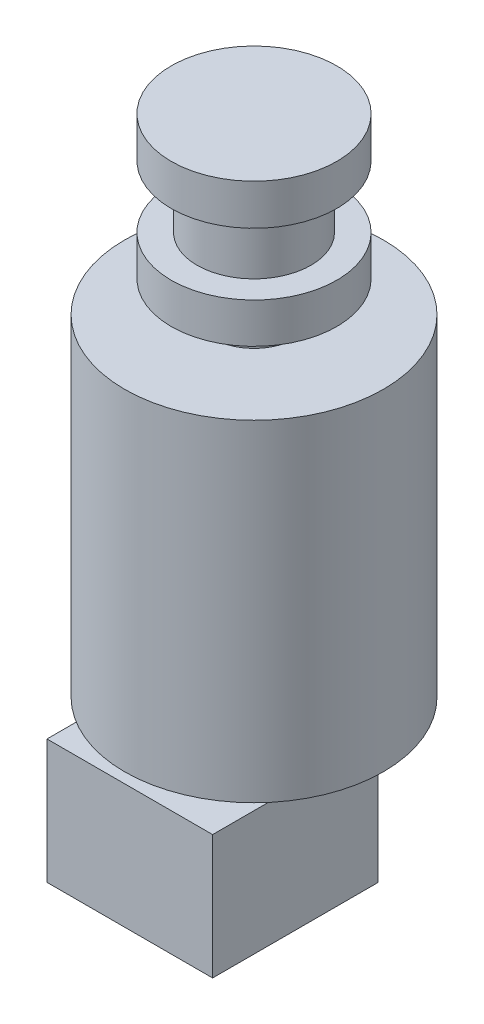
ISO-10303-21;
HEADER;
FILE_DESCRIPTION(('STEP AP214'),'2;1');
FILE_NAME('part.step','',(''),(''),'','','');
FILE_SCHEMA(('AUTOMOTIVE_DESIGN { 1 0 10303 214 1 1 1 1 }'));
ENDSEC;
DATA;
#1=APPLICATION_CONTEXT('core data for automotive mechanical design processes');
#2=APPLICATION_PROTOCOL_DEFINITION('international standard','automotive_design',2000,#1);
#3=PRODUCT_CONTEXT('',#1,'mechanical');
#4=PRODUCT('Part','Part','',(#3));
#5=PRODUCT_RELATED_PRODUCT_CATEGORY('part','',(#4));
#6=PRODUCT_DEFINITION_FORMATION('','',#4);
#7=PRODUCT_DEFINITION_CONTEXT('part definition',#1,'design');
#8=PRODUCT_DEFINITION('design','',#6,#7);
#9=PRODUCT_DEFINITION_SHAPE('','',#8);
#10=(LENGTH_UNIT() NAMED_UNIT(*) SI_UNIT(.MILLI.,.METRE.));
#11=(NAMED_UNIT(*) PLANE_ANGLE_UNIT() SI_UNIT($,.RADIAN.));
#12=(NAMED_UNIT(*) SI_UNIT($,.STERADIAN.) SOLID_ANGLE_UNIT());
#13=UNCERTAINTY_MEASURE_WITH_UNIT(LENGTH_MEASURE(1.E-05),#10,'distance_accuracy_value','');
#14=(GEOMETRIC_REPRESENTATION_CONTEXT(3) GLOBAL_UNCERTAINTY_ASSIGNED_CONTEXT((#13)) GLOBAL_UNIT_ASSIGNED_CONTEXT((#10,
#11,#12)) REPRESENTATION_CONTEXT('',''));
#15=CARTESIAN_POINT('',(0.,0.,0.));
#16=DIRECTION('',(0.,0.,1.));
#17=DIRECTION('',(1.,0.,0.));
#18=AXIS2_PLACEMENT_3D('',#15,#16,#17);
#19=CARTESIAN_POINT('',(0.,47.3333622183709,0.));
#20=DIRECTION('',(0.,-1.,0.));
#21=DIRECTION('',(0.,0.,-1.));
#22=AXIS2_PLACEMENT_3D('',#19,#20,#21);
#23=PLANE('',#22);
#24=CARTESIAN_POINT('',(0.,47.3333622183709,0.));
#25=DIRECTION('',(0.,1.,0.));
#26=DIRECTION('',(0.,0.,1.));
#27=AXIS2_PLACEMENT_3D('',#24,#25,#26);
#28=CIRCLE('',#27,8.);
#29=CARTESIAN_POINT('',(0.,47.3333622183709,8.));
#30=VERTEX_POINT('',#29);
#31=EDGE_CURVE('E11',#30,#30,#28,.T.);
#32=ORIENTED_EDGE('',*,*,#31,.T.);
#33=EDGE_LOOP('',(#32));
#34=FACE_BOUND('',#33,.T.);
#35=ADVANCED_FACE('F33',(#34),#23,.F.);
#36=CARTESIAN_POINT('',(0.,47.3333622183709,0.));
#37=DIRECTION('',(0.,1.,0.));
#38=DIRECTION('',(0.,0.,1.));
#39=AXIS2_PLACEMENT_3D('',#36,#37,#38);
#40=CYLINDRICAL_SURFACE('',#39,8.);
#41=ORIENTED_EDGE('',*,*,#31,.F.);
#42=EDGE_LOOP('',(#41));
#43=FACE_BOUND('',#42,.T.);
#44=CARTESIAN_POINT('',(0.,43.3916496951795,0.));
#45=DIRECTION('',(0.,1.,0.));
#46=DIRECTION('',(0.,0.,1.));
#47=AXIS2_PLACEMENT_3D('',#44,#45,#46);
#48=CIRCLE('',#47,8.);
#49=CARTESIAN_POINT('',(0.,43.3916496951795,8.));
#50=VERTEX_POINT('',#49);
#51=EDGE_CURVE('E41',#50,#50,#48,.T.);
#52=ORIENTED_EDGE('',*,*,#51,.T.);
#53=EDGE_LOOP('',(#52));
#54=FACE_BOUND('',#53,.T.);
#55=ADVANCED_FACE('F142',(#43,#54),#40,.T.);
#56=CARTESIAN_POINT('',(5.5,43.3916496951795,0.));
#57=DIRECTION('',(0.,1.,0.));
#58=DIRECTION('',(0.,0.,1.));
#59=AXIS2_PLACEMENT_3D('',#56,#57,#58);
#60=PLANE('',#59);
#61=ORIENTED_EDGE('',*,*,#51,.F.);
#62=EDGE_LOOP('',(#61));
#63=FACE_BOUND('',#62,.T.);
#64=CARTESIAN_POINT('',(0.,43.3916496951795,0.));
#65=DIRECTION('',(0.,1.,0.));
#66=DIRECTION('',(0.,0.,1.));
#67=AXIS2_PLACEMENT_3D('',#64,#65,#66);
#68=CIRCLE('',#67,5.5);
#69=CARTESIAN_POINT('',(0.,43.3916496951795,5.5));
#70=VERTEX_POINT('',#69);
#71=EDGE_CURVE('E137',#70,#70,#68,.T.);
#72=ORIENTED_EDGE('',*,*,#71,.T.);
#73=EDGE_LOOP('',(#72));
#74=FACE_BOUND('',#73,.T.);
#75=ADVANCED_FACE('F144',(#63,#74),#60,.F.);
#76=CARTESIAN_POINT('',(0.,47.3333622183709,0.));
#77=DIRECTION('',(0.,1.,0.));
#78=DIRECTION('',(0.,0.,1.));
#79=AXIS2_PLACEMENT_3D('',#76,#77,#78);
#80=CYLINDRICAL_SURFACE('',#79,5.5);
#81=ORIENTED_EDGE('',*,*,#71,.F.);
#82=EDGE_LOOP('',(#81));
#83=FACE_BOUND('',#82,.T.);
#84=CARTESIAN_POINT('',(0.,37.3916496951795,0.));
#85=DIRECTION('',(0.,1.,0.));
#86=DIRECTION('',(0.,0.,1.));
#87=AXIS2_PLACEMENT_3D('',#84,#85,#86);
#88=CIRCLE('',#87,5.5);
#89=CARTESIAN_POINT('',(0.,37.3916496951795,5.5));
#90=VERTEX_POINT('',#89);
#91=EDGE_CURVE('E134',#90,#90,#88,.T.);
#92=ORIENTED_EDGE('',*,*,#91,.T.);
#93=EDGE_LOOP('',(#92));
#94=FACE_BOUND('',#93,.T.);
#95=ADVANCED_FACE('F147',(#83,#94),#80,.T.);
#96=CARTESIAN_POINT('',(5.5,37.3916496951795,0.));
#97=DIRECTION('',(0.,-1.,0.));
#98=DIRECTION('',(0.,0.,-1.));
#99=AXIS2_PLACEMENT_3D('',#96,#97,#98);
#100=PLANE('',#99);
#101=ORIENTED_EDGE('',*,*,#91,.F.);
#102=EDGE_LOOP('',(#101));
#103=FACE_BOUND('',#102,.T.);
#104=CARTESIAN_POINT('',(0.,37.3916496951795,0.));
#105=DIRECTION('',(0.,1.,0.));
#106=DIRECTION('',(0.,0.,1.));
#107=AXIS2_PLACEMENT_3D('',#104,#105,#106);
#108=CIRCLE('',#107,8.);
#109=CARTESIAN_POINT('',(0.,37.3916496951795,8.));
#110=VERTEX_POINT('',#109);
#111=EDGE_CURVE('E131',#110,#110,#108,.T.);
#112=ORIENTED_EDGE('',*,*,#111,.T.);
#113=EDGE_LOOP('',(#112));
#114=FACE_BOUND('',#113,.T.);
#115=ADVANCED_FACE('F153',(#103,#114),#100,.F.);
#116=CARTESIAN_POINT('',(0.,47.3333622183709,0.));
#117=DIRECTION('',(0.,1.,0.));
#118=DIRECTION('',(0.,0.,1.));
#119=AXIS2_PLACEMENT_3D('',#116,#117,#118);
#120=CYLINDRICAL_SURFACE('',#119,8.);
#121=ORIENTED_EDGE('',*,*,#111,.F.);
#122=EDGE_LOOP('',(#121));
#123=FACE_BOUND('',#122,.T.);
#124=CARTESIAN_POINT('',(0.,33.514974638981,0.));
#125=DIRECTION('',(0.,1.,0.));
#126=DIRECTION('',(0.,0.,1.));
#127=AXIS2_PLACEMENT_3D('',#124,#125,#126);
#128=CIRCLE('',#127,8.);
#129=CARTESIAN_POINT('',(0.,33.514974638981,8.));
#130=VERTEX_POINT('',#129);
#131=EDGE_CURVE('E128',#130,#130,#128,.T.);
#132=ORIENTED_EDGE('',*,*,#131,.T.);
#133=EDGE_LOOP('',(#132));
#134=FACE_BOUND('',#133,.T.);
#135=ADVANCED_FACE('F159',(#123,#134),#120,.T.);
#136=CARTESIAN_POINT('',(8.,33.514974638981,0.));
#137=DIRECTION('',(0.,1.,0.));
#138=DIRECTION('',(0.,0.,1.));
#139=AXIS2_PLACEMENT_3D('',#136,#137,#138);
#140=PLANE('',#139);
#141=ORIENTED_EDGE('',*,*,#131,.F.);
#142=EDGE_LOOP('',(#141));
#143=FACE_BOUND('',#142,.T.);
#144=CARTESIAN_POINT('',(0.,33.5149746389809,0.));
#145=DIRECTION('',(0.,1.,0.));
#146=DIRECTION('',(0.,0.,1.));
#147=AXIS2_PLACEMENT_3D('',#144,#145,#146);
#148=CIRCLE('',#147,4.);
#149=CARTESIAN_POINT('',(0.,33.5149746389809,4.));
#150=VERTEX_POINT('',#149);
#151=EDGE_CURVE('E125',#150,#150,#148,.T.);
#152=ORIENTED_EDGE('',*,*,#151,.T.);
#153=EDGE_LOOP('',(#152));
#154=FACE_BOUND('',#153,.T.);
#155=ADVANCED_FACE('F165',(#143,#154),#140,.F.);
#156=CARTESIAN_POINT('',(0.,47.3333622183709,0.));
#157=DIRECTION('',(0.,1.,0.));
#158=DIRECTION('',(0.,0.,1.));
#159=AXIS2_PLACEMENT_3D('',#156,#157,#158);
#160=CYLINDRICAL_SURFACE('',#159,4.);
#161=ORIENTED_EDGE('',*,*,#151,.F.);
#162=EDGE_LOOP('',(#161));
#163=FACE_BOUND('',#162,.T.);
#164=CARTESIAN_POINT('',(0.,30.514974638981,0.));
#165=DIRECTION('',(0.,1.,0.));
#166=DIRECTION('',(0.,0.,1.));
#167=AXIS2_PLACEMENT_3D('',#164,#165,#166);
#168=CIRCLE('',#167,4.);
#169=CARTESIAN_POINT('',(0.,30.514974638981,4.));
#170=VERTEX_POINT('',#169);
#171=EDGE_CURVE('E122',#170,#170,#168,.T.);
#172=ORIENTED_EDGE('',*,*,#171,.T.);
#173=EDGE_LOOP('',(#172));
#174=FACE_BOUND('',#173,.T.);
#175=ADVANCED_FACE('F171',(#163,#174),#160,.T.);
#176=CARTESIAN_POINT('',(4.,30.514974638981,0.));
#177=DIRECTION('',(0.,-1.,0.));
#178=DIRECTION('',(0.,0.,-1.));
#179=AXIS2_PLACEMENT_3D('',#176,#177,#178);
#180=PLANE('',#179);
#181=ORIENTED_EDGE('',*,*,#171,.F.);
#182=EDGE_LOOP('',(#181));
#183=FACE_BOUND('',#182,.T.);
#184=CARTESIAN_POINT('',(0.,30.514974638981,0.));
#185=DIRECTION('',(0.,1.,0.));
#186=DIRECTION('',(0.,0.,1.));
#187=AXIS2_PLACEMENT_3D('',#184,#185,#186);
#188=CIRCLE('',#187,12.5);
#189=CARTESIAN_POINT('',(0.,30.514974638981,12.5));
#190=VERTEX_POINT('',#189);
#191=EDGE_CURVE('E119',#190,#190,#188,.T.);
#192=ORIENTED_EDGE('',*,*,#191,.T.);
#193=EDGE_LOOP('',(#192));
#194=FACE_BOUND('',#193,.T.);
#195=ADVANCED_FACE('F177',(#183,#194),#180,.F.);
#196=CARTESIAN_POINT('',(0.,47.3333622183709,0.));
#197=DIRECTION('',(0.,1.,0.));
#198=DIRECTION('',(0.,0.,1.));
#199=AXIS2_PLACEMENT_3D('',#196,#197,#198);
#200=CYLINDRICAL_SURFACE('',#199,12.5);
#201=ORIENTED_EDGE('',*,*,#191,.F.);
#202=EDGE_LOOP('',(#201));
#203=FACE_BOUND('',#202,.T.);
#204=CARTESIAN_POINT('',(0.,-1.48502536101905,0.));
#205=DIRECTION('',(0.,1.,0.));
#206=DIRECTION('',(0.,0.,1.));
#207=AXIS2_PLACEMENT_3D('',#204,#205,#206);
#208=CIRCLE('',#207,12.5);
#209=CARTESIAN_POINT('',(0.,-1.48502536101905,12.5));
#210=VERTEX_POINT('',#209);
#211=EDGE_CURVE('E116',#210,#210,#208,.T.);
#212=ORIENTED_EDGE('',*,*,#211,.T.);
#213=EDGE_LOOP('',(#212));
#214=FACE_BOUND('',#213,.T.);
#215=ADVANCED_FACE('F183',(#203,#214),#200,.T.);
#216=CARTESIAN_POINT('',(12.5,-1.48502536101905,0.));
#217=DIRECTION('',(0.,1.,0.));
#218=DIRECTION('',(0.,0.,1.));
#219=AXIS2_PLACEMENT_3D('',#216,#217,#218);
#220=PLANE('',#219);
#221=ORIENTED_EDGE('',*,*,#211,.F.);
#222=EDGE_LOOP('',(#221));
#223=FACE_BOUND('',#222,.T.);
#224=CARTESIAN_POINT('',(0.,-1.48502536101905,0.));
#225=DIRECTION('',(0.,1.,0.));
#226=DIRECTION('',(0.,0.,1.));
#227=AXIS2_PLACEMENT_3D('',#224,#225,#226);
#228=CIRCLE('',#227,2.00000000000001);
#229=CARTESIAN_POINT('',(0.,-1.48502536101905,2.00000000000001));
#230=VERTEX_POINT('',#229);
#231=EDGE_CURVE('E113',#230,#230,#228,.T.);
#232=ORIENTED_EDGE('',*,*,#231,.T.);
#233=EDGE_LOOP('',(#232));
#234=FACE_BOUND('',#233,.T.);
#235=ADVANCED_FACE('F189',(#223,#234),#220,.F.);
#236=CARTESIAN_POINT('',(0.,47.3333622183709,0.));
#237=DIRECTION('',(0.,1.,0.));
#238=DIRECTION('',(0.,0.,1.));
#239=AXIS2_PLACEMENT_3D('',#236,#237,#238);
#240=CYLINDRICAL_SURFACE('',#239,2.00000000000001);
#241=ORIENTED_EDGE('',*,*,#231,.F.);
#242=EDGE_LOOP('',(#241));
#243=FACE_BOUND('',#242,.T.);
#244=CARTESIAN_POINT('',(0.,-2.98502536101905,0.));
#245=DIRECTION('',(0.,-1.,0.));
#246=DIRECTION('',(0.,0.,-1.));
#247=AXIS2_PLACEMENT_3D('',#244,#245,#246);
#248=CIRCLE('',#247,2.00000000000001);
#249=CARTESIAN_POINT('',(0.,-2.98502536101905,-2.00000000000001));
#250=VERTEX_POINT('',#249);
#251=EDGE_CURVE('E110',#250,#250,#248,.T.);
#252=ORIENTED_EDGE('',*,*,#251,.F.);
#253=EDGE_LOOP('',(#252));
#254=FACE_BOUND('',#253,.T.);
#255=ADVANCED_FACE('F195',(#243,#254),#240,.T.);
#256=CARTESIAN_POINT('',(8.,-14.9850253610191,12.));
#257=DIRECTION('',(-1.,0.,0.));
#258=DIRECTION('',(0.,0.,1.));
#259=AXIS2_PLACEMENT_3D('',#256,#257,#258);
#260=PLANE('',#259);
#261=DIRECTION('',(0.,0.,1.));
#262=VECTOR('',#261,1.);
#263=CARTESIAN_POINT('',(8.,-2.98502536101905,12.));
#264=LINE('',#263,#262);
#265=CARTESIAN_POINT('',(8.,-2.98502536101905,-4.));
#266=VERTEX_POINT('',#265);
#267=CARTESIAN_POINT('',(8.,-2.98502536101905,12.));
#268=VERTEX_POINT('',#267);
#269=EDGE_CURVE('E100',#266,#268,#264,.T.);
#270=ORIENTED_EDGE('',*,*,#269,.T.);
#271=DIRECTION('',(0.,1.,0.));
#272=VECTOR('',#271,1.);
#273=CARTESIAN_POINT('',(8.,-14.9850253610191,12.));
#274=LINE('',#273,#272);
#275=CARTESIAN_POINT('',(8.,-14.9850253610191,12.));
#276=VERTEX_POINT('',#275);
#277=EDGE_CURVE('E91',#276,#268,#274,.T.);
#278=ORIENTED_EDGE('',*,*,#277,.F.);
#279=DIRECTION('',(0.,0.,1.));
#280=VECTOR('',#279,1.);
#281=CARTESIAN_POINT('',(8.,-14.9850253610191,12.));
#282=LINE('',#281,#280);
#283=CARTESIAN_POINT('',(8.,-14.9850253610191,-4.));
#284=VERTEX_POINT('',#283);
#285=EDGE_CURVE('E85',#284,#276,#282,.T.);
#286=ORIENTED_EDGE('',*,*,#285,.F.);
#287=DIRECTION('',(0.,1.,0.));
#288=VECTOR('',#287,1.);
#289=CARTESIAN_POINT('',(8.,-14.9850253610191,-4.));
#290=LINE('',#289,#288);
#291=EDGE_CURVE('E96',#284,#266,#290,.T.);
#292=ORIENTED_EDGE('',*,*,#291,.T.);
#293=EDGE_LOOP('',(#270,#278,#286,#292));
#294=FACE_BOUND('',#293,.T.);
#295=ADVANCED_FACE('F201',(#294),#260,.F.);
#296=CARTESIAN_POINT('',(-8.,-14.9850253610191,12.));
#297=DIRECTION('',(0.,0.,-1.));
#298=DIRECTION('',(-1.,0.,0.));
#299=AXIS2_PLACEMENT_3D('',#296,#297,#298);
#300=PLANE('',#299);
#301=DIRECTION('',(-1.,0.,0.));
#302=VECTOR('',#301,1.);
#303=CARTESIAN_POINT('',(-8.,-2.98502536101905,12.));
#304=LINE('',#303,#302);
#305=CARTESIAN_POINT('',(-8.,-2.98502536101905,12.));
#306=VERTEX_POINT('',#305);
#307=EDGE_CURVE('E90',#268,#306,#304,.T.);
#308=ORIENTED_EDGE('',*,*,#307,.T.);
#309=DIRECTION('',(0.,1.,0.));
#310=VECTOR('',#309,1.);
#311=CARTESIAN_POINT('',(-8.,-14.9850253610191,12.));
#312=LINE('',#311,#310);
#313=CARTESIAN_POINT('',(-8.,-14.9850253610191,12.));
#314=VERTEX_POINT('',#313);
#315=EDGE_CURVE('E88',#314,#306,#312,.T.);
#316=ORIENTED_EDGE('',*,*,#315,.F.);
#317=DIRECTION('',(-1.,0.,0.));
#318=VECTOR('',#317,1.);
#319=CARTESIAN_POINT('',(-8.,-14.9850253610191,12.));
#320=LINE('',#319,#318);
#321=EDGE_CURVE('E80',#276,#314,#320,.T.);
#322=ORIENTED_EDGE('',*,*,#321,.F.);
#323=ORIENTED_EDGE('',*,*,#277,.T.);
#324=EDGE_LOOP('',(#308,#316,#322,#323));
#325=FACE_BOUND('',#324,.T.);
#326=ADVANCED_FACE('F89',(#325),#300,.F.);
#327=CARTESIAN_POINT('',(-8.,-14.9850253610191,12.));
#328=DIRECTION('',(1.,0.,0.));
#329=DIRECTION('',(0.,0.,-1.));
#330=AXIS2_PLACEMENT_3D('',#327,#328,#329);
#331=PLANE('',#330);
#332=DIRECTION('',(0.,0.,-1.));
#333=VECTOR('',#332,1.);
#334=CARTESIAN_POINT('',(-8.,-2.98502536101905,12.));
#335=LINE('',#334,#333);
#336=CARTESIAN_POINT('',(-8.,-2.98502536101905,-4.));
#337=VERTEX_POINT('',#336);
#338=EDGE_CURVE('E66',#306,#337,#335,.T.);
#339=ORIENTED_EDGE('',*,*,#338,.T.);
#340=DIRECTION('',(0.,1.,0.));
#341=VECTOR('',#340,1.);
#342=CARTESIAN_POINT('',(-8.,-14.9850253610191,-4.));
#343=LINE('',#342,#341);
#344=CARTESIAN_POINT('',(-8.,-14.9850253610191,-4.));
#345=VERTEX_POINT('',#344);
#346=EDGE_CURVE('E92',#345,#337,#343,.T.);
#347=ORIENTED_EDGE('',*,*,#346,.F.);
#348=DIRECTION('',(0.,0.,-1.));
#349=VECTOR('',#348,1.);
#350=CARTESIAN_POINT('',(-8.,-14.9850253610191,12.));
#351=LINE('',#350,#349);
#352=EDGE_CURVE('E83',#314,#345,#351,.T.);
#353=ORIENTED_EDGE('',*,*,#352,.F.);
#354=ORIENTED_EDGE('',*,*,#315,.T.);
#355=EDGE_LOOP('',(#339,#347,#353,#354));
#356=FACE_BOUND('',#355,.T.);
#357=ADVANCED_FACE('F94',(#356),#331,.F.);
#358=CARTESIAN_POINT('',(-8.,-14.9850253610191,-4.));
#359=DIRECTION('',(0.,0.,1.));
#360=DIRECTION('',(1.,0.,0.));
#361=AXIS2_PLACEMENT_3D('',#358,#359,#360);
#362=PLANE('',#361);
#363=DIRECTION('',(1.,0.,0.));
#364=VECTOR('',#363,1.);
#365=CARTESIAN_POINT('',(-8.,-2.98502536101905,-4.));
#366=LINE('',#365,#364);
#367=EDGE_CURVE('E72',#337,#266,#366,.T.);
#368=ORIENTED_EDGE('',*,*,#367,.T.);
#369=ORIENTED_EDGE('',*,*,#291,.F.);
#370=DIRECTION('',(1.,0.,0.));
#371=VECTOR('',#370,1.);
#372=CARTESIAN_POINT('',(-8.,-14.9850253610191,-4.));
#373=LINE('',#372,#371);
#374=EDGE_CURVE('E49',#345,#284,#373,.T.);
#375=ORIENTED_EDGE('',*,*,#374,.F.);
#376=ORIENTED_EDGE('',*,*,#346,.T.);
#377=EDGE_LOOP('',(#368,#369,#375,#376));
#378=FACE_BOUND('',#377,.T.);
#379=ADVANCED_FACE('F212',(#378),#362,.F.);
#380=CARTESIAN_POINT('',(0.,-14.9850253610191,0.));
#381=DIRECTION('',(0.,-1.,0.));
#382=DIRECTION('',(0.,0.,-1.));
#383=AXIS2_PLACEMENT_3D('',#380,#381,#382);
#384=PLANE('',#383);
#385=CARTESIAN_POINT('',(0.,-14.9850253610191,0.));
#386=DIRECTION('',(0.,-1.,0.));
#387=DIRECTION('',(0.,0.,-1.));
#388=AXIS2_PLACEMENT_3D('',#385,#386,#387);
#389=CIRCLE('',#388,3.);
#390=CARTESIAN_POINT('',(0.,-14.9850253610191,-3.));
#391=VERTEX_POINT('',#390);
#392=EDGE_CURVE('E284',#391,#391,#389,.T.);
#393=ORIENTED_EDGE('',*,*,#392,.F.);
#394=EDGE_LOOP('',(#393));
#395=FACE_BOUND('',#394,.T.);
#396=ORIENTED_EDGE('',*,*,#285,.T.);
#397=ORIENTED_EDGE('',*,*,#321,.T.);
#398=ORIENTED_EDGE('',*,*,#352,.T.);
#399=ORIENTED_EDGE('',*,*,#374,.T.);
#400=EDGE_LOOP('',(#396,#397,#398,#399));
#401=FACE_BOUND('',#400,.T.);
#402=ADVANCED_FACE('F81',(#395,#401),#384,.T.);
#403=CARTESIAN_POINT('',(0.,-2.98502536101905,0.));
#404=DIRECTION('',(0.,-1.,0.));
#405=DIRECTION('',(0.,0.,-1.));
#406=AXIS2_PLACEMENT_3D('',#403,#404,#405);
#407=PLANE('',#406);
#408=ORIENTED_EDGE('',*,*,#251,.T.);
#409=EDGE_LOOP('',(#408));
#410=FACE_BOUND('',#409,.T.);
#411=ORIENTED_EDGE('',*,*,#269,.F.);
#412=ORIENTED_EDGE('',*,*,#367,.F.);
#413=ORIENTED_EDGE('',*,*,#338,.F.);
#414=ORIENTED_EDGE('',*,*,#307,.F.);
#415=EDGE_LOOP('',(#411,#412,#413,#414));
#416=FACE_BOUND('',#415,.T.);
#417=ADVANCED_FACE('F205',(#410,#416),#407,.F.);
#418=CARTESIAN_POINT('',(0.,-14.9850253610191,0.));
#419=DIRECTION('',(0.,1.,0.));
#420=DIRECTION('',(0.,0.,-1.));
#421=AXIS2_PLACEMENT_3D('',#418,#419,#420);
#422=CONICAL_SURFACE('',#421,3.,0.401425727958696);
#423=CARTESIAN_POINT('',(0.,-20.9850253610191,0.));
#424=DIRECTION('',(0.,-1.,0.));
#425=DIRECTION('',(0.,0.,-1.));
#426=AXIS2_PLACEMENT_3D('',#423,#424,#425);
#427=CIRCLE('',#426,0.453151102742371);
#428=CARTESIAN_POINT('',(0.,-20.9850253610191,-0.453151102742371));
#429=VERTEX_POINT('',#428);
#430=EDGE_CURVE('E103',#429,#429,#427,.T.);
#431=CARTESIAN_POINT('',(0.,-20.9850253610191,-0.453151102742371));
#432=CARTESIAN_POINT('',(0.,-20.9225253610191,-0.479680778755471));
#433=CARTESIAN_POINT('',(0.,-20.8600253610191,-0.506210454768572));
#434=CARTESIAN_POINT('',(0.,-20.7350253610191,-0.559269806794773));
#435=CARTESIAN_POINT('',(0.,-20.6725253610191,-0.585799482807873));
#436=CARTESIAN_POINT('',(0.,-20.5475253610191,-0.638858834834074));
#437=CARTESIAN_POINT('',(0.,-20.4850253610191,-0.665388510847174));
#438=CARTESIAN_POINT('',(0.,-20.3600253610191,-0.718447862873374));
#439=CARTESIAN_POINT('',(0.,-20.2975253610191,-0.744977538886475));
#440=CARTESIAN_POINT('',(0.,-20.1725253610191,-0.798036890912675));
#441=CARTESIAN_POINT('',(0.,-20.1100253610191,-0.824566566925776));
#442=CARTESIAN_POINT('',(0.,-19.9850253610191,-0.877625918951976));
#443=CARTESIAN_POINT('',(0.,-19.9225253610191,-0.904155594965077));
#444=CARTESIAN_POINT('',(0.,-19.7975253610191,-0.957214946991277));
#445=CARTESIAN_POINT('',(0.,-19.7350253610191,-0.983744623004377));
#446=CARTESIAN_POINT('',(0.,-19.6100253610191,-1.03680397503058));
#447=CARTESIAN_POINT('',(0.,-19.5475253610191,-1.06333365104368));
#448=CARTESIAN_POINT('',(0.,-19.4225253610191,-1.11639300306988));
#449=CARTESIAN_POINT('',(0.,-19.3600253610191,-1.14292267908298));
#450=CARTESIAN_POINT('',(0.,-19.2350253610191,-1.19598203110918));
#451=CARTESIAN_POINT('',(0.,-19.1725253610191,-1.22251170712228));
#452=CARTESIAN_POINT('',(0.,-19.0475253610191,-1.27557105914848));
#453=CARTESIAN_POINT('',(0.,-18.9850253610191,-1.30210073516158));
#454=CARTESIAN_POINT('',(0.,-18.8600253610191,-1.35516008718778));
#455=CARTESIAN_POINT('',(0.,-18.7975253610191,-1.38168976320088));
#456=CARTESIAN_POINT('',(0.,-18.6725253610191,-1.43474911522708));
#457=CARTESIAN_POINT('',(0.,-18.6100253610191,-1.46127879124018));
#458=CARTESIAN_POINT('',(0.,-18.4850253610191,-1.51433814326638));
#459=CARTESIAN_POINT('',(0.,-18.4225253610191,-1.54086781927948));
#460=CARTESIAN_POINT('',(0.,-18.2975253610191,-1.59392717130568));
#461=CARTESIAN_POINT('',(0.,-18.2350253610191,-1.62045684731878));
#462=CARTESIAN_POINT('',(0.,-18.1100253610191,-1.67351619934499));
#463=CARTESIAN_POINT('',(0.,-18.0475253610191,-1.70004587535809));
#464=CARTESIAN_POINT('',(0.,-17.9225253610191,-1.75310522738429));
#465=CARTESIAN_POINT('',(0.,-17.860025361019,-1.77963490339739));
#466=CARTESIAN_POINT('',(0.,-17.735025361019,-1.83269425542359));
#467=CARTESIAN_POINT('',(0.,-17.672525361019,-1.85922393143669));
#468=CARTESIAN_POINT('',(0.,-17.547525361019,-1.91228328346289));
#469=CARTESIAN_POINT('',(0.,-17.485025361019,-1.93881295947599));
#470=CARTESIAN_POINT('',(0.,-17.360025361019,-1.99187231150219));
#471=CARTESIAN_POINT('',(0.,-17.2975253610191,-2.01840198751529));
#472=CARTESIAN_POINT('',(0.,-17.1725253610191,-2.07146133954149));
#473=CARTESIAN_POINT('',(0.,-17.1100253610191,-2.09799101555459));
#474=CARTESIAN_POINT('',(0.,-16.9850253610191,-2.15105036758079));
#475=CARTESIAN_POINT('',(0.,-16.9225253610191,-2.17758004359389));
#476=CARTESIAN_POINT('',(0.,-16.7975253610191,-2.23063939562009));
#477=CARTESIAN_POINT('',(0.,-16.7350253610191,-2.25716907163319));
#478=CARTESIAN_POINT('',(0.,-16.6100253610191,-2.31022842365939));
#479=CARTESIAN_POINT('',(0.,-16.5475253610191,-2.33675809967249));
#480=CARTESIAN_POINT('',(0.,-16.4225253610191,-2.38981745169869));
#481=CARTESIAN_POINT('',(0.,-16.3600253610191,-2.41634712771179));
#482=CARTESIAN_POINT('',(0.,-16.2350253610191,-2.46940647973799));
#483=CARTESIAN_POINT('',(0.,-16.1725253610191,-2.4959361557511));
#484=CARTESIAN_POINT('',(0.,-16.0475253610191,-2.54899550777729));
#485=CARTESIAN_POINT('',(0.,-15.9850253610191,-2.5755251837904));
#486=CARTESIAN_POINT('',(0.,-15.8600253610191,-2.6285845358166));
#487=CARTESIAN_POINT('',(0.,-15.7975253610191,-2.6551142118297));
#488=CARTESIAN_POINT('',(0.,-15.6725253610191,-2.7081735638559));
#489=CARTESIAN_POINT('',(0.,-15.6100253610191,-2.734703239869));
#490=CARTESIAN_POINT('',(0.,-15.4850253610191,-2.7877625918952));
#491=CARTESIAN_POINT('',(0.,-15.4225253610191,-2.8142922679083));
#492=CARTESIAN_POINT('',(0.,-15.2975253610191,-2.8673516199345));
#493=CARTESIAN_POINT('',(0.,-15.2350253610191,-2.8938812959476));
#494=CARTESIAN_POINT('',(0.,-15.1100253610191,-2.9469406479738));
#495=CARTESIAN_POINT('',(0.,-15.0475253610191,-2.9734703239869));
#496=CARTESIAN_POINT('',(0.,-14.9850253610191,-3.));
#497=B_SPLINE_CURVE_WITH_KNOTS('',3,(#431,#432,#433,#434,#435,#436,#437,#438,#439,#440,#441,
#442,#443,#444,#445,#446,#447,#448,#449,#450,#451,#452,#453,#454,#455,#456,#457,#458,#459,#460,
#461,#462,#463,#464,#465,#466,#467,#468,#469,#470,#471,#472,#473,#474,#475,#476,#477,#478,#479,
#480,#481,#482,#483,#484,#485,#486,#487,#488,#489,#490,#491,#492,#493,#494,#495,#496),
.UNSPECIFIED.,.F.,.F.,(4,2,2,2,2,2,2,2,2,2,2,2,2,2,2,2,2,2,2,2,2,2,2,2,2,2,2,2,2,2,2,2,4),(0.,
0.203692570763493,0.407385141526987,0.61107771229048,0.814770283053973,1.01846285381747,
1.22215542458096,1.42584799534445,1.62954056610795,1.83323313687144,2.03692570763493,
2.24061827839843,2.44431084916192,2.64800341992541,2.8516959906889,3.0553885614524,
3.25908113221589,3.46277370297938,3.66646627374288,3.87015884450637,4.07385141526986,
4.27754398603335,4.48123655679685,4.68492912756034,4.88862169832383,5.09231426908733,
5.29600683985082,5.49969941061431,5.7033919813778,5.9070845521413,6.11077712290479,
6.31446969366828,6.51816226443178),.UNSPECIFIED.);
#498=EDGE_CURVE('BSEAM208',#429,#391,#497,.T.);
#499=ORIENTED_EDGE('',*,*,#430,.F.);
#500=ORIENTED_EDGE('',*,*,#392,.T.);
#501=ORIENTED_EDGE('',*,*,#498,.T.);
#502=ORIENTED_EDGE('',*,*,#498,.F.);
#503=EDGE_LOOP('',(#499,#501,#500,#502));
#504=FACE_BOUND('',#503,.T.);
#505=ADVANCED_FACE('F208',(#504),#422,.T.);
#506=CARTESIAN_POINT('',(0.,-20.9850253610191,0.));
#507=DIRECTION('',(0.,-1.,0.));
#508=DIRECTION('',(0.,0.,-1.));
#509=AXIS2_PLACEMENT_3D('',#506,#507,#508);
#510=PLANE('',#509);
#511=ORIENTED_EDGE('',*,*,#430,.T.);
#512=EDGE_LOOP('',(#511));
#513=FACE_BOUND('',#512,.T.);
#514=ADVANCED_FACE('F268',(#513),#510,.T.);
#515=CLOSED_SHELL('',(#35,#55,#75,#95,#115,#135,#155,#175,#195,#215,#235,#255,#295,#326,#357,
#379,#402,#417,#505,#514));
#516=MANIFOLD_SOLID_BREP('B2',#515);
#517=ADVANCED_BREP_SHAPE_REPRESENTATION('',(#18,#516),#14);
#518=SHAPE_DEFINITION_REPRESENTATION(#9,#517);
ENDSEC;
END-ISO-10303-21;
